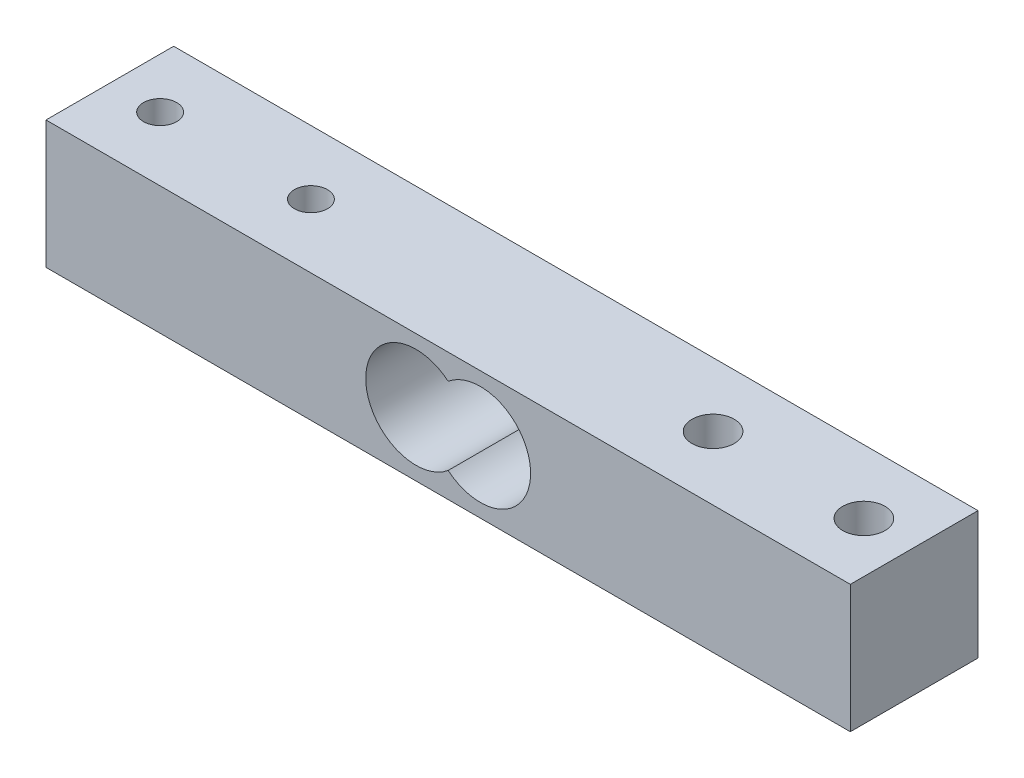
ISO-10303-21;
HEADER;
FILE_DESCRIPTION(('STEP AP214'),'2;1');
FILE_NAME('part.step','',(''),(''),'','','');
FILE_SCHEMA(('AUTOMOTIVE_DESIGN { 1 0 10303 214 1 1 1 1 }'));
ENDSEC;
DATA;
#1=APPLICATION_CONTEXT('core data for automotive mechanical design processes');
#2=APPLICATION_PROTOCOL_DEFINITION('international standard','automotive_design',2000,#1);
#3=PRODUCT_CONTEXT('',#1,'mechanical');
#4=PRODUCT('Part','Part','',(#3));
#5=PRODUCT_RELATED_PRODUCT_CATEGORY('part','',(#4));
#6=PRODUCT_DEFINITION_FORMATION('','',#4);
#7=PRODUCT_DEFINITION_CONTEXT('part definition',#1,'design');
#8=PRODUCT_DEFINITION('design','',#6,#7);
#9=PRODUCT_DEFINITION_SHAPE('','',#8);
#10=(LENGTH_UNIT() NAMED_UNIT(*) SI_UNIT(.MILLI.,.METRE.));
#11=(NAMED_UNIT(*) PLANE_ANGLE_UNIT() SI_UNIT($,.RADIAN.));
#12=(NAMED_UNIT(*) SI_UNIT($,.STERADIAN.) SOLID_ANGLE_UNIT());
#13=UNCERTAINTY_MEASURE_WITH_UNIT(LENGTH_MEASURE(1.E-05),#10,'distance_accuracy_value','');
#14=(GEOMETRIC_REPRESENTATION_CONTEXT(3) GLOBAL_UNCERTAINTY_ASSIGNED_CONTEXT((#13)) GLOBAL_UNIT_ASSIGNED_CONTEXT((#10,
#11,#12)) REPRESENTATION_CONTEXT('',''));
#15=CARTESIAN_POINT('',(0.,0.,0.));
#16=DIRECTION('',(0.,0.,1.));
#17=DIRECTION('',(1.,0.,0.));
#18=AXIS2_PLACEMENT_3D('',#15,#16,#17);
#19=CARTESIAN_POINT('',(0.,0.,12.7));
#20=DIRECTION('',(0.,0.,-1.));
#21=DIRECTION('',(-1.,0.,0.));
#22=AXIS2_PLACEMENT_3D('',#19,#20,#21);
#23=PLANE('',#22);
#24=DIRECTION('',(0.,-1.,0.));
#25=VECTOR('',#24,1.);
#26=CARTESIAN_POINT('',(-40.,6.35,12.7));
#27=LINE('',#26,#25);
#28=CARTESIAN_POINT('',(-40.,6.35,12.7));
#29=VERTEX_POINT('',#28);
#30=CARTESIAN_POINT('',(-40.,-6.35,12.7));
#31=VERTEX_POINT('',#30);
#32=EDGE_CURVE('E108',#29,#31,#27,.T.);
#33=ORIENTED_EDGE('',*,*,#32,.T.);
#34=DIRECTION('',(1.,0.,0.));
#35=VECTOR('',#34,1.);
#36=CARTESIAN_POINT('',(40.,-6.34999999999999,12.7));
#37=LINE('',#36,#35);
#38=CARTESIAN_POINT('',(40.,-6.34999999999999,12.7));
#39=VERTEX_POINT('',#38);
#40=EDGE_CURVE('E111',#31,#39,#37,.T.);
#41=ORIENTED_EDGE('',*,*,#40,.T.);
#42=DIRECTION('',(0.,1.,0.));
#43=VECTOR('',#42,1.);
#44=CARTESIAN_POINT('',(40.,6.35000000000001,12.7));
#45=LINE('',#44,#43);
#46=CARTESIAN_POINT('',(40.,6.35000000000001,12.7));
#47=VERTEX_POINT('',#46);
#48=EDGE_CURVE('E114',#39,#47,#45,.T.);
#49=ORIENTED_EDGE('',*,*,#48,.T.);
#50=DIRECTION('',(-1.,0.,0.));
#51=VECTOR('',#50,1.);
#52=CARTESIAN_POINT('',(40.,6.35000000000001,12.7));
#53=LINE('',#52,#51);
#54=EDGE_CURVE('E116',#47,#29,#53,.T.);
#55=ORIENTED_EDGE('',*,*,#54,.T.);
#56=EDGE_LOOP('',(#33,#41,#49,#55));
#57=FACE_BOUND('',#56,.T.);
#58=CARTESIAN_POINT('',(3.20079404560755,0.,12.7));
#59=DIRECTION('',(0.,0.,1.));
#60=DIRECTION('',(-1.,0.,0.));
#61=AXIS2_PLACEMENT_3D('',#58,#59,#60);
#62=CIRCLE('',#61,5.);
#63=CARTESIAN_POINT('',(0.,-3.84121302163825,12.7));
#64=VERTEX_POINT('',#63);
#65=CARTESIAN_POINT('',(0.,3.84121302163825,12.7));
#66=VERTEX_POINT('',#65);
#67=EDGE_CURVE('E94',#64,#66,#62,.T.);
#68=ORIENTED_EDGE('',*,*,#67,.F.);
#69=CARTESIAN_POINT('',(-3.20079404560754,0.,12.7));
#70=DIRECTION('',(0.,0.,1.));
#71=DIRECTION('',(1.,0.,0.));
#72=AXIS2_PLACEMENT_3D('',#69,#70,#71);
#73=CIRCLE('',#72,5.);
#74=EDGE_CURVE('E88',#66,#64,#73,.T.);
#75=ORIENTED_EDGE('',*,*,#74,.F.);
#76=EDGE_LOOP('',(#68,#75));
#77=FACE_BOUND('',#76,.T.);
#78=ADVANCED_FACE('F36',(#57,#77),#23,.F.);
#79=CARTESIAN_POINT('',(0.,0.,0.));
#80=DIRECTION('',(0.,0.,-1.));
#81=DIRECTION('',(-1.,0.,0.));
#82=AXIS2_PLACEMENT_3D('',#79,#80,#81);
#83=PLANE('',#82);
#84=DIRECTION('',(0.,-1.,0.));
#85=VECTOR('',#84,1.);
#86=CARTESIAN_POINT('',(-40.,6.35,0.));
#87=LINE('',#86,#85);
#88=CARTESIAN_POINT('',(-40.,6.35,0.));
#89=VERTEX_POINT('',#88);
#90=CARTESIAN_POINT('',(-40.,-6.35,0.));
#91=VERTEX_POINT('',#90);
#92=EDGE_CURVE('E107',#89,#91,#87,.T.);
#93=ORIENTED_EDGE('',*,*,#92,.F.);
#94=DIRECTION('',(-1.,0.,0.));
#95=VECTOR('',#94,1.);
#96=CARTESIAN_POINT('',(40.,6.35000000000001,0.));
#97=LINE('',#96,#95);
#98=CARTESIAN_POINT('',(40.,6.35000000000001,0.));
#99=VERTEX_POINT('',#98);
#100=EDGE_CURVE('E112',#99,#89,#97,.T.);
#101=ORIENTED_EDGE('',*,*,#100,.F.);
#102=DIRECTION('',(0.,1.,0.));
#103=VECTOR('',#102,1.);
#104=CARTESIAN_POINT('',(40.,6.35000000000001,0.));
#105=LINE('',#104,#103);
#106=CARTESIAN_POINT('',(40.,-6.34999999999999,0.));
#107=VERTEX_POINT('',#106);
#108=EDGE_CURVE('E123',#107,#99,#105,.T.);
#109=ORIENTED_EDGE('',*,*,#108,.F.);
#110=DIRECTION('',(1.,0.,0.));
#111=VECTOR('',#110,1.);
#112=CARTESIAN_POINT('',(40.,-6.34999999999999,0.));
#113=LINE('',#112,#111);
#114=EDGE_CURVE('E121',#91,#107,#113,.T.);
#115=ORIENTED_EDGE('',*,*,#114,.F.);
#116=EDGE_LOOP('',(#93,#101,#109,#115));
#117=FACE_BOUND('',#116,.T.);
#118=CARTESIAN_POINT('',(-3.20079404560754,0.,0.));
#119=DIRECTION('',(0.,0.,1.));
#120=DIRECTION('',(1.,0.,0.));
#121=AXIS2_PLACEMENT_3D('',#118,#119,#120);
#122=CIRCLE('',#121,5.);
#123=CARTESIAN_POINT('',(0.,3.84121302163825,0.));
#124=VERTEX_POINT('',#123);
#125=CARTESIAN_POINT('',(0.,-3.84121302163825,0.));
#126=VERTEX_POINT('',#125);
#127=EDGE_CURVE('E98',#124,#126,#122,.T.);
#128=ORIENTED_EDGE('',*,*,#127,.T.);
#129=CARTESIAN_POINT('',(3.20079404560755,0.,0.));
#130=DIRECTION('',(0.,0.,1.));
#131=DIRECTION('',(-1.,0.,0.));
#132=AXIS2_PLACEMENT_3D('',#129,#130,#131);
#133=CIRCLE('',#132,5.);
#134=EDGE_CURVE('E58',#126,#124,#133,.T.);
#135=ORIENTED_EDGE('',*,*,#134,.T.);
#136=EDGE_LOOP('',(#128,#135));
#137=FACE_BOUND('',#136,.T.);
#138=ADVANCED_FACE('F141',(#117,#137),#83,.T.);
#139=CARTESIAN_POINT('',(-40.,6.35,12.7));
#140=DIRECTION('',(1.,0.,0.));
#141=DIRECTION('',(0.,0.,-1.));
#142=AXIS2_PLACEMENT_3D('',#139,#140,#141);
#143=PLANE('',#142);
#144=ORIENTED_EDGE('',*,*,#92,.T.);
#145=DIRECTION('',(0.,0.,-1.));
#146=VECTOR('',#145,1.);
#147=CARTESIAN_POINT('',(-40.,-6.35,12.7));
#148=LINE('',#147,#146);
#149=EDGE_CURVE('E11',#31,#91,#148,.T.);
#150=ORIENTED_EDGE('',*,*,#149,.F.);
#151=ORIENTED_EDGE('',*,*,#32,.F.);
#152=DIRECTION('',(0.,0.,-1.));
#153=VECTOR('',#152,1.);
#154=CARTESIAN_POINT('',(-40.,6.35,12.7));
#155=LINE('',#154,#153);
#156=EDGE_CURVE('E118',#29,#89,#155,.T.);
#157=ORIENTED_EDGE('',*,*,#156,.T.);
#158=EDGE_LOOP('',(#144,#150,#151,#157));
#159=FACE_BOUND('',#158,.T.);
#160=ADVANCED_FACE('F38',(#159),#143,.F.);
#161=CARTESIAN_POINT('',(40.,-6.34999999999999,12.7));
#162=DIRECTION('',(0.,1.,0.));
#163=DIRECTION('',(-1.,0.,0.));
#164=AXIS2_PLACEMENT_3D('',#161,#162,#163);
#165=PLANE('',#164);
#166=CARTESIAN_POINT('',(35.,-6.35,6.35));
#167=DIRECTION('',(0.,1.,0.));
#168=DIRECTION('',(0.,0.,1.));
#169=AXIS2_PLACEMENT_3D('',#166,#167,#168);
#170=CIRCLE('',#169,2.1);
#171=CARTESIAN_POINT('',(35.,-6.35,8.45));
#172=VERTEX_POINT('',#171);
#173=EDGE_CURVE('E201',#172,#172,#170,.T.);
#174=ORIENTED_EDGE('',*,*,#173,.T.);
#175=EDGE_LOOP('',(#174));
#176=FACE_BOUND('',#175,.T.);
#177=CARTESIAN_POINT('',(20.,-6.35,6.35));
#178=DIRECTION('',(0.,1.,0.));
#179=DIRECTION('',(0.,0.,1.));
#180=AXIS2_PLACEMENT_3D('',#177,#178,#179);
#181=CIRCLE('',#180,2.1);
#182=CARTESIAN_POINT('',(20.,-6.35,8.45));
#183=VERTEX_POINT('',#182);
#184=EDGE_CURVE('E197',#183,#183,#181,.T.);
#185=ORIENTED_EDGE('',*,*,#184,.T.);
#186=EDGE_LOOP('',(#185));
#187=FACE_BOUND('',#186,.T.);
#188=CARTESIAN_POINT('',(-35.,-6.35000000000001,6.35));
#189=DIRECTION('',(0.,1.,0.));
#190=DIRECTION('',(0.,0.,1.));
#191=AXIS2_PLACEMENT_3D('',#188,#189,#190);
#192=CIRCLE('',#191,1.65);
#193=CARTESIAN_POINT('',(-35.,-6.35000000000001,8.));
#194=VERTEX_POINT('',#193);
#195=EDGE_CURVE('E191',#194,#194,#192,.T.);
#196=ORIENTED_EDGE('',*,*,#195,.T.);
#197=EDGE_LOOP('',(#196));
#198=FACE_BOUND('',#197,.T.);
#199=CARTESIAN_POINT('',(-20.,-6.35000000000001,6.35));
#200=DIRECTION('',(0.,1.,0.));
#201=DIRECTION('',(0.,0.,1.));
#202=AXIS2_PLACEMENT_3D('',#199,#200,#201);
#203=CIRCLE('',#202,1.65);
#204=CARTESIAN_POINT('',(-20.,-6.35000000000001,7.99999999999999));
#205=VERTEX_POINT('',#204);
#206=EDGE_CURVE('E102',#205,#205,#203,.T.);
#207=ORIENTED_EDGE('',*,*,#206,.T.);
#208=EDGE_LOOP('',(#207));
#209=FACE_BOUND('',#208,.T.);
#210=ORIENTED_EDGE('',*,*,#114,.T.);
#211=DIRECTION('',(0.,0.,-1.));
#212=VECTOR('',#211,1.);
#213=CARTESIAN_POINT('',(40.,-6.34999999999999,12.7));
#214=LINE('',#213,#212);
#215=EDGE_CURVE('E44',#39,#107,#214,.T.);
#216=ORIENTED_EDGE('',*,*,#215,.F.);
#217=ORIENTED_EDGE('',*,*,#40,.F.);
#218=ORIENTED_EDGE('',*,*,#149,.T.);
#219=EDGE_LOOP('',(#210,#216,#217,#218));
#220=FACE_BOUND('',#219,.T.);
#221=ADVANCED_FACE('F151',(#176,#187,#198,#209,#220),#165,.F.);
#222=CARTESIAN_POINT('',(40.,6.35000000000001,12.7));
#223=DIRECTION('',(-1.,0.,0.));
#224=DIRECTION('',(0.,-1.,0.));
#225=AXIS2_PLACEMENT_3D('',#222,#223,#224);
#226=PLANE('',#225);
#227=ORIENTED_EDGE('',*,*,#108,.T.);
#228=DIRECTION('',(0.,0.,-1.));
#229=VECTOR('',#228,1.);
#230=CARTESIAN_POINT('',(40.,6.35000000000001,12.7));
#231=LINE('',#230,#229);
#232=EDGE_CURVE('E128',#47,#99,#231,.T.);
#233=ORIENTED_EDGE('',*,*,#232,.F.);
#234=ORIENTED_EDGE('',*,*,#48,.F.);
#235=ORIENTED_EDGE('',*,*,#215,.T.);
#236=EDGE_LOOP('',(#227,#233,#234,#235));
#237=FACE_BOUND('',#236,.T.);
#238=ADVANCED_FACE('F135',(#237),#226,.F.);
#239=CARTESIAN_POINT('',(40.,6.35000000000001,12.7));
#240=DIRECTION('',(0.,-1.,0.));
#241=DIRECTION('',(1.,0.,0.));
#242=AXIS2_PLACEMENT_3D('',#239,#240,#241);
#243=PLANE('',#242);
#244=CARTESIAN_POINT('',(35.,6.35000000000001,6.35));
#245=DIRECTION('',(0.,1.,0.));
#246=DIRECTION('',(0.,0.,1.));
#247=AXIS2_PLACEMENT_3D('',#244,#245,#246);
#248=CIRCLE('',#247,2.1);
#249=CARTESIAN_POINT('',(35.,6.35000000000001,8.45));
#250=VERTEX_POINT('',#249);
#251=EDGE_CURVE('E178',#250,#250,#248,.T.);
#252=ORIENTED_EDGE('',*,*,#251,.F.);
#253=EDGE_LOOP('',(#252));
#254=FACE_BOUND('',#253,.T.);
#255=CARTESIAN_POINT('',(20.,6.35,6.35));
#256=DIRECTION('',(0.,1.,0.));
#257=DIRECTION('',(0.,0.,1.));
#258=AXIS2_PLACEMENT_3D('',#255,#256,#257);
#259=CIRCLE('',#258,2.1);
#260=CARTESIAN_POINT('',(20.,6.35,8.45));
#261=VERTEX_POINT('',#260);
#262=EDGE_CURVE('E182',#261,#261,#259,.T.);
#263=ORIENTED_EDGE('',*,*,#262,.F.);
#264=EDGE_LOOP('',(#263));
#265=FACE_BOUND('',#264,.T.);
#266=CARTESIAN_POINT('',(-35.,6.35,6.35));
#267=DIRECTION('',(0.,1.,0.));
#268=DIRECTION('',(0.,0.,1.));
#269=AXIS2_PLACEMENT_3D('',#266,#267,#268);
#270=CIRCLE('',#269,1.64999999999999);
#271=CARTESIAN_POINT('',(-35.,6.35,7.99999999999999));
#272=VERTEX_POINT('',#271);
#273=EDGE_CURVE('E186',#272,#272,#270,.T.);
#274=ORIENTED_EDGE('',*,*,#273,.F.);
#275=EDGE_LOOP('',(#274));
#276=FACE_BOUND('',#275,.T.);
#277=CARTESIAN_POINT('',(-20.,6.35,6.35));
#278=DIRECTION('',(0.,1.,0.));
#279=DIRECTION('',(0.,0.,1.));
#280=AXIS2_PLACEMENT_3D('',#277,#278,#279);
#281=CIRCLE('',#280,1.64999999999999);
#282=CARTESIAN_POINT('',(-20.,6.35,7.99999999999999));
#283=VERTEX_POINT('',#282);
#284=EDGE_CURVE('E189',#283,#283,#281,.T.);
#285=ORIENTED_EDGE('',*,*,#284,.F.);
#286=EDGE_LOOP('',(#285));
#287=FACE_BOUND('',#286,.T.);
#288=ORIENTED_EDGE('',*,*,#100,.T.);
#289=ORIENTED_EDGE('',*,*,#156,.F.);
#290=ORIENTED_EDGE('',*,*,#54,.F.);
#291=ORIENTED_EDGE('',*,*,#232,.T.);
#292=EDGE_LOOP('',(#288,#289,#290,#291));
#293=FACE_BOUND('',#292,.T.);
#294=ADVANCED_FACE('F145',(#254,#265,#276,#287,#293),#243,.F.);
#295=CARTESIAN_POINT('',(3.20079404560755,0.,12.7));
#296=DIRECTION('',(0.,0.,-1.));
#297=DIRECTION('',(-1.,0.,0.));
#298=AXIS2_PLACEMENT_3D('',#295,#296,#297);
#299=CYLINDRICAL_SURFACE('',#298,5.);
#300=ORIENTED_EDGE('',*,*,#134,.F.);
#301=DIRECTION('',(0.,0.,-1.));
#302=VECTOR('',#301,1.);
#303=CARTESIAN_POINT('',(0.,-3.84121302163825,12.7));
#304=LINE('',#303,#302);
#305=EDGE_CURVE('E90',#64,#126,#304,.T.);
#306=ORIENTED_EDGE('',*,*,#305,.F.);
#307=ORIENTED_EDGE('',*,*,#67,.T.);
#308=DIRECTION('',(0.,0.,-1.));
#309=VECTOR('',#308,1.);
#310=CARTESIAN_POINT('',(0.,3.84121302163825,12.7));
#311=LINE('',#310,#309);
#312=EDGE_CURVE('E51',#66,#124,#311,.T.);
#313=ORIENTED_EDGE('',*,*,#312,.T.);
#314=EDGE_LOOP('',(#300,#306,#307,#313));
#315=FACE_BOUND('',#314,.T.);
#316=ADVANCED_FACE('F96',(#315),#299,.F.);
#317=CARTESIAN_POINT('',(-3.20079404560754,0.,12.7));
#318=DIRECTION('',(0.,0.,-1.));
#319=DIRECTION('',(-1.,0.,0.));
#320=AXIS2_PLACEMENT_3D('',#317,#318,#319);
#321=CYLINDRICAL_SURFACE('',#320,5.);
#322=ORIENTED_EDGE('',*,*,#127,.F.);
#323=ORIENTED_EDGE('',*,*,#312,.F.);
#324=ORIENTED_EDGE('',*,*,#74,.T.);
#325=ORIENTED_EDGE('',*,*,#305,.T.);
#326=EDGE_LOOP('',(#322,#323,#324,#325));
#327=FACE_BOUND('',#326,.T.);
#328=ADVANCED_FACE('F89',(#327),#321,.F.);
#329=CARTESIAN_POINT('',(-20.,6.35,6.35));
#330=DIRECTION('',(0.,1.,0.));
#331=DIRECTION('',(0.,0.,1.));
#332=AXIS2_PLACEMENT_3D('',#329,#330,#331);
#333=CYLINDRICAL_SURFACE('',#332,1.64999999999999);
#334=ORIENTED_EDGE('',*,*,#206,.F.);
#335=EDGE_LOOP('',(#334));
#336=FACE_BOUND('',#335,.T.);
#337=ORIENTED_EDGE('',*,*,#284,.T.);
#338=EDGE_LOOP('',(#337));
#339=FACE_BOUND('',#338,.T.);
#340=ADVANCED_FACE('F219',(#336,#339),#333,.F.);
#341=CARTESIAN_POINT('',(-35.,6.35,6.35));
#342=DIRECTION('',(0.,1.,0.));
#343=DIRECTION('',(0.,0.,1.));
#344=AXIS2_PLACEMENT_3D('',#341,#342,#343);
#345=CYLINDRICAL_SURFACE('',#344,1.65);
#346=ORIENTED_EDGE('',*,*,#195,.F.);
#347=EDGE_LOOP('',(#346));
#348=FACE_BOUND('',#347,.T.);
#349=ORIENTED_EDGE('',*,*,#273,.T.);
#350=EDGE_LOOP('',(#349));
#351=FACE_BOUND('',#350,.T.);
#352=ADVANCED_FACE('F212',(#348,#351),#345,.F.);
#353=CARTESIAN_POINT('',(20.,6.35,6.35));
#354=DIRECTION('',(0.,1.,0.));
#355=DIRECTION('',(0.,0.,1.));
#356=AXIS2_PLACEMENT_3D('',#353,#354,#355);
#357=CYLINDRICAL_SURFACE('',#356,2.1);
#358=ORIENTED_EDGE('',*,*,#184,.F.);
#359=EDGE_LOOP('',(#358));
#360=FACE_BOUND('',#359,.T.);
#361=ORIENTED_EDGE('',*,*,#262,.T.);
#362=EDGE_LOOP('',(#361));
#363=FACE_BOUND('',#362,.T.);
#364=ADVANCED_FACE('F206',(#360,#363),#357,.F.);
#365=CARTESIAN_POINT('',(35.,6.35000000000001,6.35));
#366=DIRECTION('',(0.,1.,0.));
#367=DIRECTION('',(0.,0.,1.));
#368=AXIS2_PLACEMENT_3D('',#365,#366,#367);
#369=CYLINDRICAL_SURFACE('',#368,2.1);
#370=ORIENTED_EDGE('',*,*,#173,.F.);
#371=EDGE_LOOP('',(#370));
#372=FACE_BOUND('',#371,.T.);
#373=ORIENTED_EDGE('',*,*,#251,.T.);
#374=EDGE_LOOP('',(#373));
#375=FACE_BOUND('',#374,.T.);
#376=ADVANCED_FACE('F204',(#372,#375),#369,.F.);
#377=CLOSED_SHELL('',(#78,#138,#160,#221,#238,#294,#316,#328,#340,#352,#364,#376));
#378=MANIFOLD_SOLID_BREP('B2',#377);
#379=ADVANCED_BREP_SHAPE_REPRESENTATION('',(#18,#378),#14);
#380=SHAPE_DEFINITION_REPRESENTATION(#9,#379);
ENDSEC;
END-ISO-10303-21;
